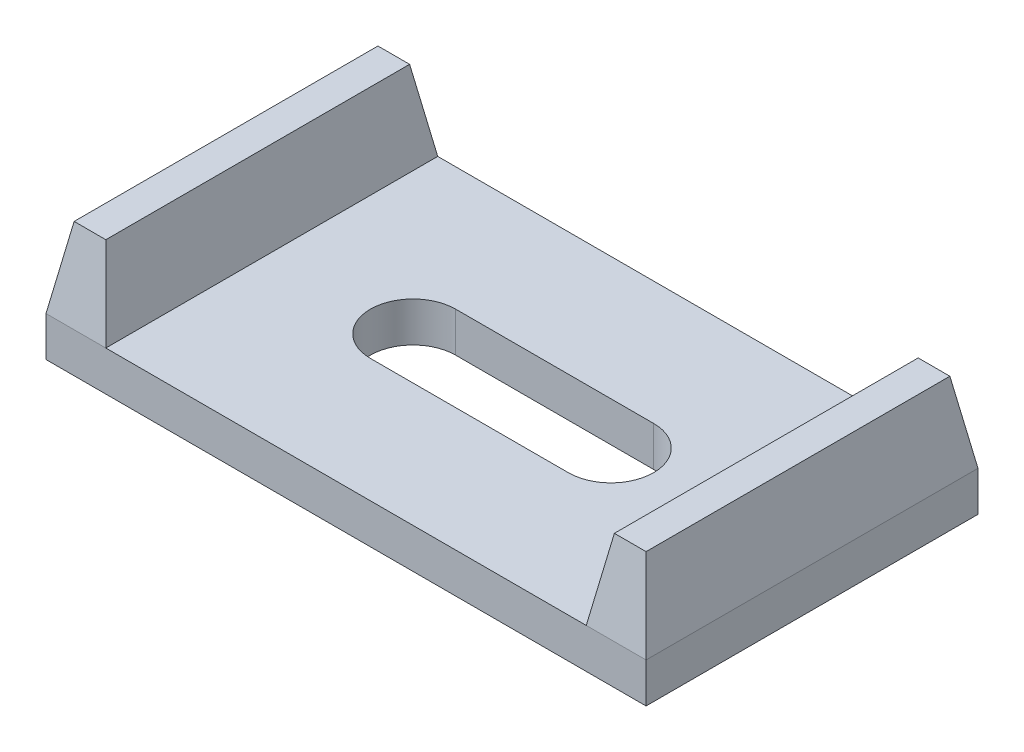
ISO-10303-21;
HEADER;
FILE_DESCRIPTION(('STEP AP214'),'2;1');
FILE_NAME('part.step','',(''),(''),'','','');
FILE_SCHEMA(('AUTOMOTIVE_DESIGN { 1 0 10303 214 1 1 1 1 }'));
ENDSEC;
DATA;
#1=APPLICATION_CONTEXT('core data for automotive mechanical design processes');
#2=APPLICATION_PROTOCOL_DEFINITION('international standard','automotive_design',2000,#1);
#3=PRODUCT_CONTEXT('',#1,'mechanical');
#4=PRODUCT('Part','Part','',(#3));
#5=PRODUCT_RELATED_PRODUCT_CATEGORY('part','',(#4));
#6=PRODUCT_DEFINITION_FORMATION('','',#4);
#7=PRODUCT_DEFINITION_CONTEXT('part definition',#1,'design');
#8=PRODUCT_DEFINITION('design','',#6,#7);
#9=PRODUCT_DEFINITION_SHAPE('','',#8);
#10=(LENGTH_UNIT() NAMED_UNIT(*) SI_UNIT(.MILLI.,.METRE.));
#11=(NAMED_UNIT(*) PLANE_ANGLE_UNIT() SI_UNIT($,.RADIAN.));
#12=(NAMED_UNIT(*) SI_UNIT($,.STERADIAN.) SOLID_ANGLE_UNIT());
#13=UNCERTAINTY_MEASURE_WITH_UNIT(LENGTH_MEASURE(1.E-05),#10,'distance_accuracy_value','');
#14=(GEOMETRIC_REPRESENTATION_CONTEXT(3) GLOBAL_UNCERTAINTY_ASSIGNED_CONTEXT((#13)) GLOBAL_UNIT_ASSIGNED_CONTEXT((#10,
#11,#12)) REPRESENTATION_CONTEXT('',''));
#15=CARTESIAN_POINT('',(0.,0.,0.));
#16=DIRECTION('',(0.,0.,1.));
#17=DIRECTION('',(1.,0.,0.));
#18=AXIS2_PLACEMENT_3D('',#15,#16,#17);
#19=CARTESIAN_POINT('',(0.,10.,0.));
#20=DIRECTION('',(0.,-1.,0.));
#21=DIRECTION('',(0.,0.,-1.));
#22=AXIS2_PLACEMENT_3D('',#19,#20,#21);
#23=PLANE('',#22);
#24=CARTESIAN_POINT('',(-24.8210071487796,10.,0.));
#25=DIRECTION('',(0.,1.,0.));
#26=DIRECTION('',(0.,0.,1.));
#27=AXIS2_PLACEMENT_3D('',#24,#25,#26);
#28=CIRCLE('',#27,10.695894527928);
#29=CARTESIAN_POINT('',(-24.8210071487796,10.,-10.695894527928));
#30=VERTEX_POINT('',#29);
#31=CARTESIAN_POINT('',(-24.8210071487796,10.,10.695894527928));
#32=VERTEX_POINT('',#31);
#33=EDGE_CURVE('E87',#30,#32,#28,.T.);
#34=ORIENTED_EDGE('',*,*,#33,.F.);
#35=DIRECTION('',(-1.,0.,0.));
#36=VECTOR('',#35,1.);
#37=CARTESIAN_POINT('',(24.8210071487796,10.,-10.695894527928));
#38=LINE('',#37,#36);
#39=CARTESIAN_POINT('',(24.8210071487796,10.,-10.695894527928));
#40=VERTEX_POINT('',#39);
#41=EDGE_CURVE('E179',#40,#30,#38,.T.);
#42=ORIENTED_EDGE('',*,*,#41,.F.);
#43=CARTESIAN_POINT('',(24.8210071487796,10.,0.));
#44=DIRECTION('',(0.,1.,0.));
#45=DIRECTION('',(0.,0.,1.));
#46=AXIS2_PLACEMENT_3D('',#43,#44,#45);
#47=CIRCLE('',#46,10.695894527928);
#48=CARTESIAN_POINT('',(24.8210071487796,10.,10.695894527928));
#49=VERTEX_POINT('',#48);
#50=EDGE_CURVE('E194',#49,#40,#47,.T.);
#51=ORIENTED_EDGE('',*,*,#50,.F.);
#52=DIRECTION('',(-1.,0.,0.));
#53=VECTOR('',#52,1.);
#54=CARTESIAN_POINT('',(24.8210071487796,10.,10.695894527928));
#55=LINE('',#54,#53);
#56=EDGE_CURVE('E192',#49,#32,#55,.T.);
#57=ORIENTED_EDGE('',*,*,#56,.T.);
#58=EDGE_LOOP('',(#34,#42,#51,#57));
#59=FACE_BOUND('',#58,.T.);
#60=DIRECTION('',(0.,0.,-1.));
#61=VECTOR('',#60,1.);
#62=CARTESIAN_POINT('',(-60.2365091434145,10.,-41.6175374497625));
#63=LINE('',#62,#61);
#64=CARTESIAN_POINT('',(-60.2365091434145,10.,41.6175374497625));
#65=VERTEX_POINT('',#64);
#66=CARTESIAN_POINT('',(-60.2365091434145,10.,-41.6175374497625));
#67=VERTEX_POINT('',#66);
#68=EDGE_CURVE('E203',#65,#67,#63,.T.);
#69=ORIENTED_EDGE('',*,*,#68,.F.);
#70=DIRECTION('',(1.,0.,0.));
#71=VECTOR('',#70,1.);
#72=CARTESIAN_POINT('',(-75.2365091434145,10.,41.6175374497625));
#73=LINE('',#72,#71);
#74=CARTESIAN_POINT('',(60.2365091434145,10.,41.6175374497625));
#75=VERTEX_POINT('',#74);
#76=EDGE_CURVE('E269',#65,#75,#73,.T.);
#77=ORIENTED_EDGE('',*,*,#76,.T.);
#78=DIRECTION('',(0.,0.,1.));
#79=VECTOR('',#78,1.);
#80=CARTESIAN_POINT('',(60.2365091434145,10.,-41.6175374497625));
#81=LINE('',#80,#79);
#82=CARTESIAN_POINT('',(60.2365091434144,10.,-41.6175374497625));
#83=VERTEX_POINT('',#82);
#84=EDGE_CURVE('E207',#83,#75,#81,.T.);
#85=ORIENTED_EDGE('',*,*,#84,.F.);
#86=DIRECTION('',(-1.,0.,0.));
#87=VECTOR('',#86,1.);
#88=CARTESIAN_POINT('',(-75.2365091434145,10.,-41.6175374497625));
#89=LINE('',#88,#87);
#90=EDGE_CURVE('E261',#83,#67,#89,.T.);
#91=ORIENTED_EDGE('',*,*,#90,.T.);
#92=EDGE_LOOP('',(#69,#77,#85,#91));
#93=FACE_BOUND('',#92,.T.);
#94=ADVANCED_FACE('F72',(#59,#93),#23,.F.);
#95=CARTESIAN_POINT('',(75.2365091434145,10.,41.6175374497625));
#96=DIRECTION('',(-1.,0.,0.));
#97=DIRECTION('',(0.,0.,1.));
#98=AXIS2_PLACEMENT_3D('',#95,#96,#97);
#99=PLANE('',#98);
#100=DIRECTION('',(0.,0.,-1.));
#101=VECTOR('',#100,1.);
#102=CARTESIAN_POINT('',(75.2365091434145,0.,41.6175374497625));
#103=LINE('',#102,#101);
#104=CARTESIAN_POINT('',(75.2365091434145,0.,41.6175374497625));
#105=VERTEX_POINT('',#104);
#106=CARTESIAN_POINT('',(75.2365091434145,0.,-41.6175374497625));
#107=VERTEX_POINT('',#106);
#108=EDGE_CURVE('E214',#105,#107,#103,.T.);
#109=ORIENTED_EDGE('',*,*,#108,.T.);
#110=DIRECTION('',(0.,-1.,0.));
#111=VECTOR('',#110,1.);
#112=CARTESIAN_POINT('',(75.2365091434145,10.,-41.6175374497625));
#113=LINE('',#112,#111);
#114=CARTESIAN_POINT('',(75.2365091434145,10.,-41.6175374497625));
#115=VERTEX_POINT('',#114);
#116=EDGE_CURVE('E12',#115,#107,#113,.T.);
#117=ORIENTED_EDGE('',*,*,#116,.F.);
#118=DIRECTION('',(0.,0.,-1.));
#119=VECTOR('',#118,1.);
#120=CARTESIAN_POINT('',(75.2365091434145,10.,41.6175374497625));
#121=LINE('',#120,#119);
#122=CARTESIAN_POINT('',(75.2365091434145,10.,41.6175374497625));
#123=VERTEX_POINT('',#122);
#124=EDGE_CURVE('E258',#123,#115,#121,.T.);
#125=ORIENTED_EDGE('',*,*,#124,.F.);
#126=DIRECTION('',(0.,-1.,0.));
#127=VECTOR('',#126,1.);
#128=CARTESIAN_POINT('',(75.2365091434145,10.,41.6175374497625));
#129=LINE('',#128,#127);
#130=EDGE_CURVE('E273',#123,#105,#129,.T.);
#131=ORIENTED_EDGE('',*,*,#130,.T.);
#132=EDGE_LOOP('',(#109,#117,#125,#131));
#133=FACE_BOUND('',#132,.T.);
#134=ADVANCED_FACE('F74',(#133),#99,.F.);
#135=CARTESIAN_POINT('',(-75.2365091434145,10.,-41.6175374497625));
#136=DIRECTION('',(0.,0.,1.));
#137=DIRECTION('',(1.,0.,0.));
#138=AXIS2_PLACEMENT_3D('',#135,#136,#137);
#139=PLANE('',#138);
#140=DIRECTION('',(-1.,0.,0.));
#141=VECTOR('',#140,1.);
#142=CARTESIAN_POINT('',(-75.2365091434145,0.,-41.6175374497625));
#143=LINE('',#142,#141);
#144=CARTESIAN_POINT('',(-75.2365091434145,0.,-41.6175374497625));
#145=VERTEX_POINT('',#144);
#146=EDGE_CURVE('E276',#107,#145,#143,.T.);
#147=ORIENTED_EDGE('',*,*,#146,.T.);
#148=DIRECTION('',(0.,-1.,0.));
#149=VECTOR('',#148,1.);
#150=CARTESIAN_POINT('',(-75.2365091434145,10.,-41.6175374497625));
#151=LINE('',#150,#149);
#152=CARTESIAN_POINT('',(-75.2365091434145,10.,-41.6175374497625));
#153=VERTEX_POINT('',#152);
#154=EDGE_CURVE('E80',#153,#145,#151,.T.);
#155=ORIENTED_EDGE('',*,*,#154,.F.);
#156=DIRECTION('',(-1.,0.,0.));
#157=VECTOR('',#156,1.);
#158=CARTESIAN_POINT('',(-75.2365091434145,10.,-41.6175374497625));
#159=LINE('',#158,#157);
#160=EDGE_CURVE('E206',#67,#153,#159,.T.);
#161=ORIENTED_EDGE('',*,*,#160,.F.);
#162=ORIENTED_EDGE('',*,*,#90,.F.);
#163=EDGE_CURVE('E263',#115,#83,#89,.T.);
#164=ORIENTED_EDGE('',*,*,#163,.F.);
#165=ORIENTED_EDGE('',*,*,#116,.T.);
#166=EDGE_LOOP('',(#147,#155,#161,#162,#164,#165));
#167=FACE_BOUND('',#166,.T.);
#168=ADVANCED_FACE('F319',(#167),#139,.F.);
#169=CARTESIAN_POINT('',(-75.2365091434145,10.,41.6175374497625));
#170=DIRECTION('',(1.,0.,0.));
#171=DIRECTION('',(0.,0.,-1.));
#172=AXIS2_PLACEMENT_3D('',#169,#170,#171);
#173=PLANE('',#172);
#174=DIRECTION('',(0.,0.,1.));
#175=VECTOR('',#174,1.);
#176=CARTESIAN_POINT('',(-75.2365091434145,0.,41.6175374497625));
#177=LINE('',#176,#175);
#178=CARTESIAN_POINT('',(-75.2365091434145,0.,41.6175374497625));
#179=VERTEX_POINT('',#178);
#180=EDGE_CURVE('E278',#145,#179,#177,.T.);
#181=ORIENTED_EDGE('',*,*,#180,.T.);
#182=DIRECTION('',(0.,-1.,0.));
#183=VECTOR('',#182,1.);
#184=CARTESIAN_POINT('',(-75.2365091434145,10.,41.6175374497625));
#185=LINE('',#184,#183);
#186=CARTESIAN_POINT('',(-75.2365091434145,10.,41.6175374497625));
#187=VERTEX_POINT('',#186);
#188=EDGE_CURVE('E283',#187,#179,#185,.T.);
#189=ORIENTED_EDGE('',*,*,#188,.F.);
#190=DIRECTION('',(0.,0.,1.));
#191=VECTOR('',#190,1.);
#192=CARTESIAN_POINT('',(-75.2365091434145,10.,41.6175374497625));
#193=LINE('',#192,#191);
#194=EDGE_CURVE('E266',#153,#187,#193,.T.);
#195=ORIENTED_EDGE('',*,*,#194,.F.);
#196=ORIENTED_EDGE('',*,*,#154,.T.);
#197=EDGE_LOOP('',(#181,#189,#195,#196));
#198=FACE_BOUND('',#197,.T.);
#199=ADVANCED_FACE('F289',(#198),#173,.F.);
#200=CARTESIAN_POINT('',(-75.2365091434145,10.,41.6175374497625));
#201=DIRECTION('',(0.,0.,-1.));
#202=DIRECTION('',(-1.,0.,0.));
#203=AXIS2_PLACEMENT_3D('',#200,#201,#202);
#204=PLANE('',#203);
#205=DIRECTION('',(1.,0.,0.));
#206=VECTOR('',#205,1.);
#207=CARTESIAN_POINT('',(-75.2365091434145,0.,41.6175374497625));
#208=LINE('',#207,#206);
#209=EDGE_CURVE('E262',#179,#105,#208,.T.);
#210=ORIENTED_EDGE('',*,*,#209,.T.);
#211=ORIENTED_EDGE('',*,*,#130,.F.);
#212=DIRECTION('',(1.,0.,0.));
#213=VECTOR('',#212,1.);
#214=CARTESIAN_POINT('',(75.2365091434145,10.,41.6175374497625));
#215=LINE('',#214,#213);
#216=EDGE_CURVE('E242',#75,#123,#215,.T.);
#217=ORIENTED_EDGE('',*,*,#216,.F.);
#218=ORIENTED_EDGE('',*,*,#76,.F.);
#219=EDGE_CURVE('E270',#187,#65,#73,.T.);
#220=ORIENTED_EDGE('',*,*,#219,.F.);
#221=ORIENTED_EDGE('',*,*,#188,.T.);
#222=EDGE_LOOP('',(#210,#211,#217,#218,#220,#221));
#223=FACE_BOUND('',#222,.T.);
#224=ADVANCED_FACE('F295',(#223),#204,.F.);
#225=CARTESIAN_POINT('',(0.,0.,0.));
#226=DIRECTION('',(0.,-1.,0.));
#227=DIRECTION('',(0.,0.,-1.));
#228=AXIS2_PLACEMENT_3D('',#225,#226,#227);
#229=PLANE('',#228);
#230=DIRECTION('',(-1.,0.,0.));
#231=VECTOR('',#230,1.);
#232=CARTESIAN_POINT('',(24.8210071487796,0.,-10.695894527928));
#233=LINE('',#232,#231);
#234=CARTESIAN_POINT('',(24.8210071487796,0.,-10.695894527928));
#235=VERTEX_POINT('',#234);
#236=CARTESIAN_POINT('',(-24.8210071487796,0.,-10.695894527928));
#237=VERTEX_POINT('',#236);
#238=EDGE_CURVE('E177',#235,#237,#233,.T.);
#239=ORIENTED_EDGE('',*,*,#238,.T.);
#240=CARTESIAN_POINT('',(-24.8210071487796,0.,0.));
#241=DIRECTION('',(0.,1.,0.));
#242=DIRECTION('',(0.,0.,1.));
#243=AXIS2_PLACEMENT_3D('',#240,#241,#242);
#244=CIRCLE('',#243,10.695894527928);
#245=CARTESIAN_POINT('',(-24.8210071487796,0.,10.695894527928));
#246=VERTEX_POINT('',#245);
#247=EDGE_CURVE('E181',#237,#246,#244,.T.);
#248=ORIENTED_EDGE('',*,*,#247,.T.);
#249=DIRECTION('',(-1.,0.,0.));
#250=VECTOR('',#249,1.);
#251=CARTESIAN_POINT('',(24.8210071487796,0.,10.695894527928));
#252=LINE('',#251,#250);
#253=CARTESIAN_POINT('',(24.8210071487796,0.,10.695894527928));
#254=VERTEX_POINT('',#253);
#255=EDGE_CURVE('E191',#254,#246,#252,.T.);
#256=ORIENTED_EDGE('',*,*,#255,.F.);
#257=CARTESIAN_POINT('',(24.8210071487796,0.,0.));
#258=DIRECTION('',(0.,1.,0.));
#259=DIRECTION('',(0.,0.,1.));
#260=AXIS2_PLACEMENT_3D('',#257,#258,#259);
#261=CIRCLE('',#260,10.695894527928);
#262=EDGE_CURVE('E95',#254,#235,#261,.T.);
#263=ORIENTED_EDGE('',*,*,#262,.T.);
#264=EDGE_LOOP('',(#239,#248,#256,#263));
#265=FACE_BOUND('',#264,.T.);
#266=ORIENTED_EDGE('',*,*,#108,.F.);
#267=ORIENTED_EDGE('',*,*,#209,.F.);
#268=ORIENTED_EDGE('',*,*,#180,.F.);
#269=ORIENTED_EDGE('',*,*,#146,.F.);
#270=EDGE_LOOP('',(#266,#267,#268,#269));
#271=FACE_BOUND('',#270,.T.);
#272=ADVANCED_FACE('F189',(#265,#271),#229,.T.);
#273=CARTESIAN_POINT('',(75.2365091434145,10.,-41.6175374497625));
#274=DIRECTION('',(0.984807753012208,0.173648177666931,0.));
#275=DIRECTION('',(-0.173648177666931,0.984807753012208,0.));
#276=AXIS2_PLACEMENT_3D('',#273,#274,#275);
#277=PLANE('',#276);
#278=ORIENTED_EDGE('',*,*,#124,.T.);
#279=DIRECTION('',(0.171087869746036,-0.970287525247814,-0.171087869746036));
#280=VECTOR('',#279,1.);
#281=CARTESIAN_POINT('',(75.2365091434145,10.,-41.6175374497625));
#282=LINE('',#281,#280);
#283=CARTESIAN_POINT('',(71.7099695292452,30.,-38.0909978355932));
#284=VERTEX_POINT('',#283);
#285=EDGE_CURVE('E247',#284,#115,#282,.T.);
#286=ORIENTED_EDGE('',*,*,#285,.F.);
#287=DIRECTION('',(0.,0.,1.));
#288=VECTOR('',#287,1.);
#289=CARTESIAN_POINT('',(71.7099695292452,30.,0.));
#290=LINE('',#289,#288);
#291=CARTESIAN_POINT('',(71.7099695292452,30.,38.0909978355932));
#292=VERTEX_POINT('',#291);
#293=EDGE_CURVE('E239',#292,#284,#290,.F.);
#294=ORIENTED_EDGE('',*,*,#293,.F.);
#295=DIRECTION('',(0.171087869746036,-0.970287525247814,0.171087869746036));
#296=VECTOR('',#295,1.);
#297=CARTESIAN_POINT('',(72.8001303406585,23.8173908097721,39.1811586470065));
#298=LINE('',#297,#296);
#299=EDGE_CURVE('E235',#292,#123,#298,.T.);
#300=ORIENTED_EDGE('',*,*,#299,.T.);
#301=EDGE_LOOP('',(#278,#286,#294,#300));
#302=FACE_BOUND('',#301,.T.);
#303=ADVANCED_FACE('F310',(#302),#277,.T.);
#304=CARTESIAN_POINT('',(75.2365091434145,10.,-41.6175374497625));
#305=DIRECTION('',(0.,0.173648177666931,-0.984807753012208));
#306=DIRECTION('',(0.,0.984807753012208,0.173648177666931));
#307=AXIS2_PLACEMENT_3D('',#304,#305,#306);
#308=PLANE('',#307);
#309=ORIENTED_EDGE('',*,*,#163,.T.);
#310=DIRECTION('',(-0.171087869746036,-0.970287525247814,-0.171087869746036));
#311=VECTOR('',#310,1.);
#312=CARTESIAN_POINT('',(60.2365091434145,10.,-41.6175374497625));
#313=LINE('',#312,#311);
#314=CARTESIAN_POINT('',(63.7630487575838,30.,-38.0909978355932));
#315=VERTEX_POINT('',#314);
#316=EDGE_CURVE('E243',#315,#83,#313,.T.);
#317=ORIENTED_EDGE('',*,*,#316,.F.);
#318=DIRECTION('',(1.,0.,0.));
#319=VECTOR('',#318,1.);
#320=CARTESIAN_POINT('',(0.,30.,-38.0909978355932));
#321=LINE('',#320,#319);
#322=EDGE_CURVE('E237',#284,#315,#321,.F.);
#323=ORIENTED_EDGE('',*,*,#322,.F.);
#324=ORIENTED_EDGE('',*,*,#285,.T.);
#325=EDGE_LOOP('',(#309,#317,#323,#324));
#326=FACE_BOUND('',#325,.T.);
#327=ADVANCED_FACE('F321',(#326),#308,.T.);
#328=CARTESIAN_POINT('',(60.2365091434145,10.,-41.6175374497625));
#329=DIRECTION('',(-0.984807753012208,0.173648177666931,0.));
#330=DIRECTION('',(-0.173648177666931,-0.984807753012208,0.));
#331=AXIS2_PLACEMENT_3D('',#328,#329,#330);
#332=PLANE('',#331);
#333=ORIENTED_EDGE('',*,*,#84,.T.);
#334=DIRECTION('',(-0.171087869746036,-0.970287525247814,0.171087869746036));
#335=VECTOR('',#334,1.);
#336=CARTESIAN_POINT('',(60.675575031028,12.490066386037,41.178471562149));
#337=LINE('',#336,#335);
#338=CARTESIAN_POINT('',(63.7630487575838,30.,38.0909978355932));
#339=VERTEX_POINT('',#338);
#340=EDGE_CURVE('E246',#339,#75,#337,.T.);
#341=ORIENTED_EDGE('',*,*,#340,.F.);
#342=DIRECTION('',(0.,0.,-1.));
#343=VECTOR('',#342,1.);
#344=CARTESIAN_POINT('',(63.7630487575838,30.,0.));
#345=LINE('',#344,#343);
#346=EDGE_CURVE('E234',#315,#339,#345,.F.);
#347=ORIENTED_EDGE('',*,*,#346,.F.);
#348=ORIENTED_EDGE('',*,*,#316,.T.);
#349=EDGE_LOOP('',(#333,#341,#347,#348));
#350=FACE_BOUND('',#349,.T.);
#351=ADVANCED_FACE('F316',(#350),#332,.T.);
#352=CARTESIAN_POINT('',(75.2365091434145,10.,41.6175374497625));
#353=DIRECTION('',(0.,0.173648177666931,0.984807753012208));
#354=DIRECTION('',(0.,-0.984807753012208,0.173648177666931));
#355=AXIS2_PLACEMENT_3D('',#352,#353,#354);
#356=PLANE('',#355);
#357=ORIENTED_EDGE('',*,*,#216,.T.);
#358=ORIENTED_EDGE('',*,*,#299,.F.);
#359=DIRECTION('',(-1.,0.,0.));
#360=VECTOR('',#359,1.);
#361=CARTESIAN_POINT('',(0.,30.,38.0909978355932));
#362=LINE('',#361,#360);
#363=EDGE_CURVE('E232',#339,#292,#362,.F.);
#364=ORIENTED_EDGE('',*,*,#363,.F.);
#365=ORIENTED_EDGE('',*,*,#340,.T.);
#366=EDGE_LOOP('',(#357,#358,#364,#365));
#367=FACE_BOUND('',#366,.T.);
#368=ADVANCED_FACE('F305',(#367),#356,.T.);
#369=CARTESIAN_POINT('',(0.,30.,0.));
#370=DIRECTION('',(0.,-1.,0.));
#371=DIRECTION('',(0.,0.,-1.));
#372=AXIS2_PLACEMENT_3D('',#369,#370,#371);
#373=PLANE('',#372);
#374=ORIENTED_EDGE('',*,*,#293,.T.);
#375=ORIENTED_EDGE('',*,*,#322,.T.);
#376=ORIENTED_EDGE('',*,*,#346,.T.);
#377=ORIENTED_EDGE('',*,*,#363,.T.);
#378=EDGE_LOOP('',(#374,#375,#376,#377));
#379=FACE_BOUND('',#378,.T.);
#380=ADVANCED_FACE('F312',(#379),#373,.F.);
#381=CARTESIAN_POINT('',(-75.2365091434145,10.,-41.6175374497625));
#382=DIRECTION('',(-0.984807753012208,0.173648177666931,0.));
#383=DIRECTION('',(-0.173648177666931,-0.984807753012208,0.));
#384=AXIS2_PLACEMENT_3D('',#381,#382,#383);
#385=PLANE('',#384);
#386=ORIENTED_EDGE('',*,*,#194,.T.);
#387=DIRECTION('',(-0.171087869746036,-0.970287525247814,0.171087869746036));
#388=VECTOR('',#387,1.);
#389=CARTESIAN_POINT('',(-75.2365091434145,10.,41.6175374497625));
#390=LINE('',#389,#388);
#391=CARTESIAN_POINT('',(-71.7099695292452,30.,38.0909978355932));
#392=VERTEX_POINT('',#391);
#393=EDGE_CURVE('E211',#392,#187,#390,.T.);
#394=ORIENTED_EDGE('',*,*,#393,.F.);
#395=DIRECTION('',(0.,0.,-1.));
#396=VECTOR('',#395,1.);
#397=CARTESIAN_POINT('',(-71.7099695292452,30.,-41.6175374497625));
#398=LINE('',#397,#396);
#399=CARTESIAN_POINT('',(-71.7099695292452,30.,-38.0909978355932));
#400=VERTEX_POINT('',#399);
#401=EDGE_CURVE('E210',#400,#392,#398,.F.);
#402=ORIENTED_EDGE('',*,*,#401,.F.);
#403=DIRECTION('',(-0.171087869746036,-0.970287525247814,-0.171087869746036));
#404=VECTOR('',#403,1.);
#405=CARTESIAN_POINT('',(-75.2365091434145,10.,-41.6175374497625));
#406=LINE('',#405,#404);
#407=EDGE_CURVE('E216',#400,#153,#406,.T.);
#408=ORIENTED_EDGE('',*,*,#407,.T.);
#409=EDGE_LOOP('',(#386,#394,#402,#408));
#410=FACE_BOUND('',#409,.T.);
#411=ADVANCED_FACE('F397',(#410),#385,.T.);
#412=CARTESIAN_POINT('',(-75.2365091434145,10.,41.6175374497625));
#413=DIRECTION('',(0.,0.173648177666931,0.984807753012208));
#414=DIRECTION('',(0.,-0.984807753012208,0.173648177666931));
#415=AXIS2_PLACEMENT_3D('',#412,#413,#414);
#416=PLANE('',#415);
#417=ORIENTED_EDGE('',*,*,#219,.T.);
#418=DIRECTION('',(0.171087869746036,-0.970287525247814,0.171087869746036));
#419=VECTOR('',#418,1.);
#420=CARTESIAN_POINT('',(-62.6728879461705,23.8173908097721,39.1811586470065));
#421=LINE('',#420,#419);
#422=CARTESIAN_POINT('',(-63.7630487575838,30.,38.0909978355932));
#423=VERTEX_POINT('',#422);
#424=EDGE_CURVE('E215',#423,#65,#421,.T.);
#425=ORIENTED_EDGE('',*,*,#424,.F.);
#426=DIRECTION('',(-1.,0.,0.));
#427=VECTOR('',#426,1.);
#428=CARTESIAN_POINT('',(-75.2365091434145,30.,38.0909978355932));
#429=LINE('',#428,#427);
#430=EDGE_CURVE('E227',#392,#423,#429,.F.);
#431=ORIENTED_EDGE('',*,*,#430,.F.);
#432=ORIENTED_EDGE('',*,*,#393,.T.);
#433=EDGE_LOOP('',(#417,#425,#431,#432));
#434=FACE_BOUND('',#433,.T.);
#435=ADVANCED_FACE('F405',(#434),#416,.T.);
#436=CARTESIAN_POINT('',(-60.2365091434145,10.,-41.6175374497625));
#437=DIRECTION('',(0.984807753012208,0.173648177666931,0.));
#438=DIRECTION('',(-0.173648177666931,0.984807753012208,0.));
#439=AXIS2_PLACEMENT_3D('',#436,#437,#438);
#440=PLANE('',#439);
#441=ORIENTED_EDGE('',*,*,#68,.T.);
#442=DIRECTION('',(0.171087869746036,-0.970287525247814,-0.171087869746036));
#443=VECTOR('',#442,1.);
#444=CARTESIAN_POINT('',(-60.6755750310281,12.490066386037,-41.178471562149));
#445=LINE('',#444,#443);
#446=CARTESIAN_POINT('',(-63.7630487575838,30.,-38.0909978355932));
#447=VERTEX_POINT('',#446);
#448=EDGE_CURVE('E219',#447,#67,#445,.T.);
#449=ORIENTED_EDGE('',*,*,#448,.F.);
#450=DIRECTION('',(0.,0.,1.));
#451=VECTOR('',#450,1.);
#452=CARTESIAN_POINT('',(-63.7630487575838,30.,-41.6175374497625));
#453=LINE('',#452,#451);
#454=EDGE_CURVE('E229',#423,#447,#453,.F.);
#455=ORIENTED_EDGE('',*,*,#454,.F.);
#456=ORIENTED_EDGE('',*,*,#424,.T.);
#457=EDGE_LOOP('',(#441,#449,#455,#456));
#458=FACE_BOUND('',#457,.T.);
#459=ADVANCED_FACE('F415',(#458),#440,.T.);
#460=CARTESIAN_POINT('',(-75.2365091434145,10.,-41.6175374497625));
#461=DIRECTION('',(0.,0.173648177666931,-0.984807753012208));
#462=DIRECTION('',(0.,0.984807753012208,0.173648177666931));
#463=AXIS2_PLACEMENT_3D('',#460,#461,#462);
#464=PLANE('',#463);
#465=ORIENTED_EDGE('',*,*,#160,.T.);
#466=ORIENTED_EDGE('',*,*,#407,.F.);
#467=DIRECTION('',(1.,0.,0.));
#468=VECTOR('',#467,1.);
#469=CARTESIAN_POINT('',(-75.2365091434145,30.,-38.0909978355932));
#470=LINE('',#469,#468);
#471=EDGE_CURVE('E220',#447,#400,#470,.F.);
#472=ORIENTED_EDGE('',*,*,#471,.F.);
#473=ORIENTED_EDGE('',*,*,#448,.T.);
#474=EDGE_LOOP('',(#465,#466,#472,#473));
#475=FACE_BOUND('',#474,.T.);
#476=ADVANCED_FACE('F424',(#475),#464,.T.);
#477=CARTESIAN_POINT('',(0.,30.,0.));
#478=DIRECTION('',(0.,1.,0.));
#479=DIRECTION('',(0.,0.,1.));
#480=AXIS2_PLACEMENT_3D('',#477,#478,#479);
#481=PLANE('',#480);
#482=ORIENTED_EDGE('',*,*,#401,.T.);
#483=ORIENTED_EDGE('',*,*,#430,.T.);
#484=ORIENTED_EDGE('',*,*,#454,.T.);
#485=ORIENTED_EDGE('',*,*,#471,.T.);
#486=EDGE_LOOP('',(#482,#483,#484,#485));
#487=FACE_BOUND('',#486,.T.);
#488=ADVANCED_FACE('F434',(#487),#481,.T.);
#489=CARTESIAN_POINT('',(-24.8210071487796,0.,0.));
#490=DIRECTION('',(0.,1.,0.));
#491=DIRECTION('',(0.,0.,1.));
#492=AXIS2_PLACEMENT_3D('',#489,#490,#491);
#493=CYLINDRICAL_SURFACE('',#492,10.695894527928);
#494=ORIENTED_EDGE('',*,*,#33,.T.);
#495=DIRECTION('',(0.,1.,0.));
#496=VECTOR('',#495,1.);
#497=CARTESIAN_POINT('',(-24.8210071487796,0.,10.695894527928));
#498=LINE('',#497,#496);
#499=EDGE_CURVE('E180',#246,#32,#498,.T.);
#500=ORIENTED_EDGE('',*,*,#499,.F.);
#501=ORIENTED_EDGE('',*,*,#247,.F.);
#502=DIRECTION('',(0.,1.,0.));
#503=VECTOR('',#502,1.);
#504=CARTESIAN_POINT('',(-24.8210071487796,0.,-10.695894527928));
#505=LINE('',#504,#503);
#506=EDGE_CURVE('E173',#237,#30,#505,.T.);
#507=ORIENTED_EDGE('',*,*,#506,.T.);
#508=EDGE_LOOP('',(#494,#500,#501,#507));
#509=FACE_BOUND('',#508,.T.);
#510=ADVANCED_FACE('F184',(#509),#493,.F.);
#511=CARTESIAN_POINT('',(24.8210071487796,0.,0.));
#512=DIRECTION('',(0.,1.,0.));
#513=DIRECTION('',(0.,0.,1.));
#514=AXIS2_PLACEMENT_3D('',#511,#512,#513);
#515=CYLINDRICAL_SURFACE('',#514,10.695894527928);
#516=ORIENTED_EDGE('',*,*,#50,.T.);
#517=DIRECTION('',(0.,1.,0.));
#518=VECTOR('',#517,1.);
#519=CARTESIAN_POINT('',(24.8210071487796,0.,-10.695894527928));
#520=LINE('',#519,#518);
#521=EDGE_CURVE('E485',#40,#235,#520,.F.);
#522=ORIENTED_EDGE('',*,*,#521,.T.);
#523=ORIENTED_EDGE('',*,*,#262,.F.);
#524=DIRECTION('',(0.,1.,0.));
#525=VECTOR('',#524,1.);
#526=CARTESIAN_POINT('',(24.8210071487796,0.,10.695894527928));
#527=LINE('',#526,#525);
#528=EDGE_CURVE('E199',#49,#254,#527,.F.);
#529=ORIENTED_EDGE('',*,*,#528,.F.);
#530=EDGE_LOOP('',(#516,#522,#523,#529));
#531=FACE_BOUND('',#530,.T.);
#532=ADVANCED_FACE('F452',(#531),#515,.F.);
#533=CARTESIAN_POINT('',(24.8210071487796,0.,-10.695894527928));
#534=DIRECTION('',(0.,0.,-1.));
#535=DIRECTION('',(-1.,0.,0.));
#536=AXIS2_PLACEMENT_3D('',#533,#534,#535);
#537=PLANE('',#536);
#538=ORIENTED_EDGE('',*,*,#41,.T.);
#539=ORIENTED_EDGE('',*,*,#506,.F.);
#540=ORIENTED_EDGE('',*,*,#238,.F.);
#541=ORIENTED_EDGE('',*,*,#521,.F.);
#542=EDGE_LOOP('',(#538,#539,#540,#541));
#543=FACE_BOUND('',#542,.T.);
#544=ADVANCED_FACE('F175',(#543),#537,.F.);
#545=CARTESIAN_POINT('',(24.8210071487796,0.,10.695894527928));
#546=DIRECTION('',(0.,0.,-1.));
#547=DIRECTION('',(-1.,0.,0.));
#548=AXIS2_PLACEMENT_3D('',#545,#546,#547);
#549=PLANE('',#548);
#550=ORIENTED_EDGE('',*,*,#56,.F.);
#551=ORIENTED_EDGE('',*,*,#528,.T.);
#552=ORIENTED_EDGE('',*,*,#255,.T.);
#553=ORIENTED_EDGE('',*,*,#499,.T.);
#554=EDGE_LOOP('',(#550,#551,#552,#553));
#555=FACE_BOUND('',#554,.T.);
#556=ADVANCED_FACE('F462',(#555),#549,.T.);
#557=CLOSED_SHELL('',(#94,#134,#168,#199,#224,#272,#303,#327,#351,#368,#380,#411,#435,#459,#476,
#488,#510,#532,#544,#556));
#558=MANIFOLD_SOLID_BREP('B2',#557);
#559=ADVANCED_BREP_SHAPE_REPRESENTATION('',(#18,#558),#14);
#560=SHAPE_DEFINITION_REPRESENTATION(#9,#559);
ENDSEC;
END-ISO-10303-21;
